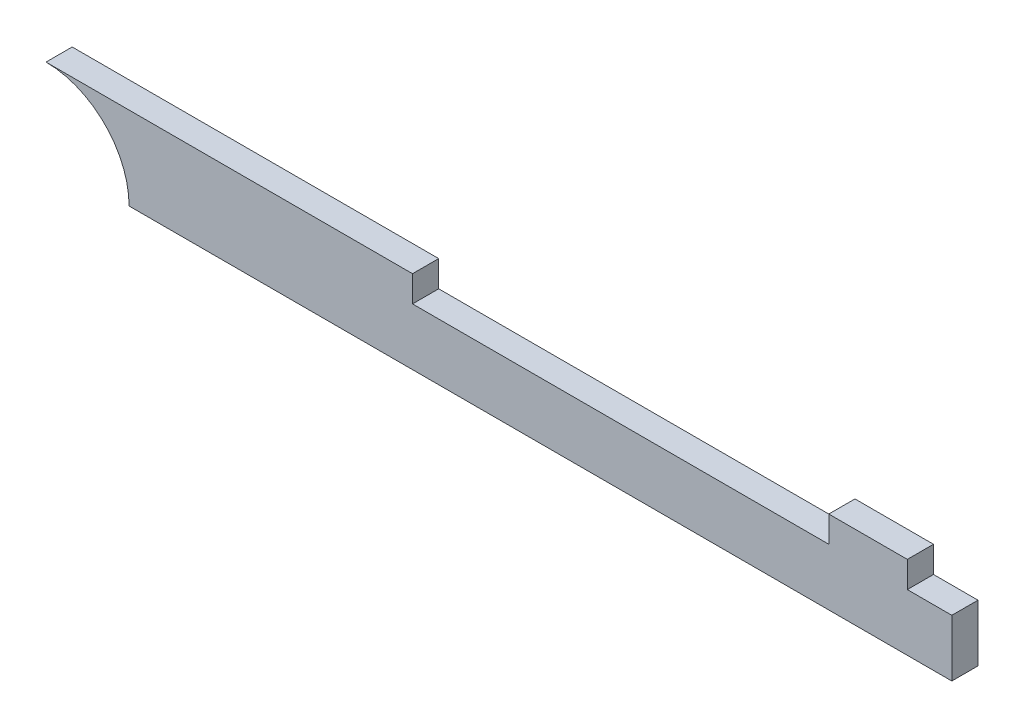
ISO-10303-21;
HEADER;
FILE_DESCRIPTION(('STEP AP214'),'2;1');
FILE_NAME('part.step','',(''),(''),'','','');
FILE_SCHEMA(('AUTOMOTIVE_DESIGN { 1 0 10303 214 1 1 1 1 }'));
ENDSEC;
DATA;
#1=APPLICATION_CONTEXT('core data for automotive mechanical design processes');
#2=APPLICATION_PROTOCOL_DEFINITION('international standard','automotive_design',2000,#1);
#3=PRODUCT_CONTEXT('',#1,'mechanical');
#4=PRODUCT('Part','Part','',(#3));
#5=PRODUCT_RELATED_PRODUCT_CATEGORY('part','',(#4));
#6=PRODUCT_DEFINITION_FORMATION('','',#4);
#7=PRODUCT_DEFINITION_CONTEXT('part definition',#1,'design');
#8=PRODUCT_DEFINITION('design','',#6,#7);
#9=PRODUCT_DEFINITION_SHAPE('','',#8);
#10=(LENGTH_UNIT() NAMED_UNIT(*) SI_UNIT(.MILLI.,.METRE.));
#11=(NAMED_UNIT(*) PLANE_ANGLE_UNIT() SI_UNIT($,.RADIAN.));
#12=(NAMED_UNIT(*) SI_UNIT($,.STERADIAN.) SOLID_ANGLE_UNIT());
#13=UNCERTAINTY_MEASURE_WITH_UNIT(LENGTH_MEASURE(1.E-05),#10,'distance_accuracy_value','');
#14=(GEOMETRIC_REPRESENTATION_CONTEXT(3) GLOBAL_UNCERTAINTY_ASSIGNED_CONTEXT((#13)) GLOBAL_UNIT_ASSIGNED_CONTEXT((#10,
#11,#12)) REPRESENTATION_CONTEXT('',''));
#15=CARTESIAN_POINT('',(0.,0.,0.));
#16=DIRECTION('',(0.,0.,1.));
#17=DIRECTION('',(1.,0.,0.));
#18=AXIS2_PLACEMENT_3D('',#15,#16,#17);
#19=CARTESIAN_POINT('',(0.,0.,2.5));
#20=DIRECTION('',(0.,0.,-1.));
#21=DIRECTION('',(-1.,0.,0.));
#22=AXIS2_PLACEMENT_3D('',#19,#20,#21);
#23=CYLINDRICAL_SURFACE('',#22,15.875);
#24=CARTESIAN_POINT('',(0.,0.,-2.5));
#25=DIRECTION('',(0.,0.,1.));
#26=DIRECTION('',(1.,0.,0.));
#27=AXIS2_PLACEMENT_3D('',#24,#25,#26);
#28=CIRCLE('',#27,15.875);
#29=CARTESIAN_POINT('',(15.875,0.,-2.5));
#30=VERTEX_POINT('',#29);
#31=CARTESIAN_POINT('',(0.,15.875,-2.5));
#32=VERTEX_POINT('',#31);
#33=EDGE_CURVE('E149',#30,#32,#28,.T.);
#34=ORIENTED_EDGE('',*,*,#33,.F.);
#35=DIRECTION('',(0.,0.,-1.));
#36=VECTOR('',#35,1.);
#37=CARTESIAN_POINT('',(15.875,0.,2.5));
#38=LINE('',#37,#36);
#39=CARTESIAN_POINT('',(15.875,0.,2.5));
#40=VERTEX_POINT('',#39);
#41=EDGE_CURVE('E11',#40,#30,#38,.T.);
#42=ORIENTED_EDGE('',*,*,#41,.F.);
#43=CARTESIAN_POINT('',(0.,0.,2.5));
#44=DIRECTION('',(0.,0.,1.));
#45=DIRECTION('',(1.,0.,0.));
#46=AXIS2_PLACEMENT_3D('',#43,#44,#45);
#47=CIRCLE('',#46,15.875);
#48=CARTESIAN_POINT('',(0.,15.875,2.5));
#49=VERTEX_POINT('',#48);
#50=EDGE_CURVE('E174',#40,#49,#47,.T.);
#51=ORIENTED_EDGE('',*,*,#50,.T.);
#52=DIRECTION('',(0.,0.,-1.));
#53=VECTOR('',#52,1.);
#54=CARTESIAN_POINT('',(0.,15.875,2.5));
#55=LINE('',#54,#53);
#56=EDGE_CURVE('E57',#49,#32,#55,.T.);
#57=ORIENTED_EDGE('',*,*,#56,.T.);
#58=EDGE_LOOP('',(#34,#42,#51,#57));
#59=FACE_BOUND('',#58,.T.);
#60=ADVANCED_FACE('F41',(#59),#23,.F.);
#61=CARTESIAN_POINT('',(0.,0.,2.5));
#62=DIRECTION('',(0.,1.,0.));
#63=DIRECTION('',(0.,0.,1.));
#64=AXIS2_PLACEMENT_3D('',#61,#62,#63);
#65=PLANE('',#64);
#66=DIRECTION('',(1.,0.,0.));
#67=VECTOR('',#66,1.);
#68=CARTESIAN_POINT('',(0.,0.,-2.5));
#69=LINE('',#68,#67);
#70=CARTESIAN_POINT('',(173.,0.,-2.5));
#71=VERTEX_POINT('',#70);
#72=EDGE_CURVE('E151',#30,#71,#69,.T.);
#73=ORIENTED_EDGE('',*,*,#72,.T.);
#74=DIRECTION('',(0.,0.,-1.));
#75=VECTOR('',#74,1.);
#76=CARTESIAN_POINT('',(173.,0.,2.5));
#77=LINE('',#76,#75);
#78=CARTESIAN_POINT('',(173.,0.,2.5));
#79=VERTEX_POINT('',#78);
#80=EDGE_CURVE('E49',#79,#71,#77,.T.);
#81=ORIENTED_EDGE('',*,*,#80,.F.);
#82=DIRECTION('',(1.,0.,0.));
#83=VECTOR('',#82,1.);
#84=CARTESIAN_POINT('',(0.,0.,2.5));
#85=LINE('',#84,#83);
#86=EDGE_CURVE('E205',#40,#79,#85,.T.);
#87=ORIENTED_EDGE('',*,*,#86,.F.);
#88=ORIENTED_EDGE('',*,*,#41,.T.);
#89=EDGE_LOOP('',(#73,#81,#87,#88));
#90=FACE_BOUND('',#89,.T.);
#91=ADVANCED_FACE('F194',(#90),#65,.F.);
#92=CARTESIAN_POINT('',(173.,0.,2.5));
#93=DIRECTION('',(1.,0.,0.));
#94=DIRECTION('',(0.,0.,-1.));
#95=AXIS2_PLACEMENT_3D('',#92,#93,#94);
#96=PLANE('',#95);
#97=DIRECTION('',(0.,-1.,0.));
#98=VECTOR('',#97,1.);
#99=CARTESIAN_POINT('',(173.,0.,-2.5));
#100=LINE('',#99,#98);
#101=CARTESIAN_POINT('',(173.,10.875,-2.5));
#102=VERTEX_POINT('',#101);
#103=EDGE_CURVE('E154',#102,#71,#100,.T.);
#104=ORIENTED_EDGE('',*,*,#103,.F.);
#105=DIRECTION('',(0.,0.,-1.));
#106=VECTOR('',#105,1.);
#107=CARTESIAN_POINT('',(173.,10.875,2.5));
#108=LINE('',#107,#106);
#109=CARTESIAN_POINT('',(173.,10.875,2.5));
#110=VERTEX_POINT('',#109);
#111=EDGE_CURVE('E184',#110,#102,#108,.T.);
#112=ORIENTED_EDGE('',*,*,#111,.F.);
#113=DIRECTION('',(0.,-1.,0.));
#114=VECTOR('',#113,1.);
#115=CARTESIAN_POINT('',(173.,0.,2.5));
#116=LINE('',#115,#114);
#117=EDGE_CURVE('E191',#110,#79,#116,.T.);
#118=ORIENTED_EDGE('',*,*,#117,.T.);
#119=ORIENTED_EDGE('',*,*,#80,.T.);
#120=EDGE_LOOP('',(#104,#112,#118,#119));
#121=FACE_BOUND('',#120,.T.);
#122=ADVANCED_FACE('F189',(#121),#96,.T.);
#123=CARTESIAN_POINT('',(0.,10.875,2.5));
#124=DIRECTION('',(0.,1.,0.));
#125=DIRECTION('',(0.,0.,1.));
#126=AXIS2_PLACEMENT_3D('',#123,#124,#125);
#127=PLANE('',#126);
#128=DIRECTION('',(1.,0.,0.));
#129=VECTOR('',#128,1.);
#130=CARTESIAN_POINT('',(0.,10.875,-2.5));
#131=LINE('',#130,#129);
#132=CARTESIAN_POINT('',(164.5,10.875,-2.5));
#133=VERTEX_POINT('',#132);
#134=EDGE_CURVE('E157',#133,#102,#131,.T.);
#135=ORIENTED_EDGE('',*,*,#134,.F.);
#136=DIRECTION('',(0.,0.,-1.));
#137=VECTOR('',#136,1.);
#138=CARTESIAN_POINT('',(164.5,10.875,2.5));
#139=LINE('',#138,#137);
#140=CARTESIAN_POINT('',(164.5,10.875,2.5));
#141=VERTEX_POINT('',#140);
#142=EDGE_CURVE('E182',#141,#133,#139,.T.);
#143=ORIENTED_EDGE('',*,*,#142,.F.);
#144=DIRECTION('',(1.,0.,0.));
#145=VECTOR('',#144,1.);
#146=CARTESIAN_POINT('',(0.,10.875,2.5));
#147=LINE('',#146,#145);
#148=EDGE_CURVE('E141',#141,#110,#147,.T.);
#149=ORIENTED_EDGE('',*,*,#148,.T.);
#150=ORIENTED_EDGE('',*,*,#111,.T.);
#151=EDGE_LOOP('',(#135,#143,#149,#150));
#152=FACE_BOUND('',#151,.T.);
#153=ADVANCED_FACE('F200',(#152),#127,.T.);
#154=CARTESIAN_POINT('',(164.5,0.,2.5));
#155=DIRECTION('',(1.,0.,0.));
#156=DIRECTION('',(0.,0.,-1.));
#157=AXIS2_PLACEMENT_3D('',#154,#155,#156);
#158=PLANE('',#157);
#159=DIRECTION('',(0.,-1.,0.));
#160=VECTOR('',#159,1.);
#161=CARTESIAN_POINT('',(164.5,0.,-2.5));
#162=LINE('',#161,#160);
#163=CARTESIAN_POINT('',(164.5,15.875,-2.5));
#164=VERTEX_POINT('',#163);
#165=EDGE_CURVE('E160',#164,#133,#162,.T.);
#166=ORIENTED_EDGE('',*,*,#165,.F.);
#167=DIRECTION('',(0.,0.,-1.));
#168=VECTOR('',#167,1.);
#169=CARTESIAN_POINT('',(164.5,15.875,2.5));
#170=LINE('',#169,#168);
#171=CARTESIAN_POINT('',(164.5,15.875,2.5));
#172=VERTEX_POINT('',#171);
#173=EDGE_CURVE('E180',#172,#164,#170,.T.);
#174=ORIENTED_EDGE('',*,*,#173,.F.);
#175=DIRECTION('',(0.,-1.,0.));
#176=VECTOR('',#175,1.);
#177=CARTESIAN_POINT('',(164.5,0.,2.5));
#178=LINE('',#177,#176);
#179=EDGE_CURVE('E207',#172,#141,#178,.T.);
#180=ORIENTED_EDGE('',*,*,#179,.T.);
#181=ORIENTED_EDGE('',*,*,#142,.T.);
#182=EDGE_LOOP('',(#166,#174,#180,#181));
#183=FACE_BOUND('',#182,.T.);
#184=ADVANCED_FACE('F217',(#183),#158,.T.);
#185=CARTESIAN_POINT('',(0.,15.875,2.5));
#186=DIRECTION('',(0.,1.,0.));
#187=DIRECTION('',(0.,0.,1.));
#188=AXIS2_PLACEMENT_3D('',#185,#186,#187);
#189=PLANE('',#188);
#190=DIRECTION('',(1.,0.,0.));
#191=VECTOR('',#190,1.);
#192=CARTESIAN_POINT('',(0.,15.875,-2.5));
#193=LINE('',#192,#191);
#194=CARTESIAN_POINT('',(149.5,15.875,-2.5));
#195=VERTEX_POINT('',#194);
#196=EDGE_CURVE('E163',#195,#164,#193,.T.);
#197=ORIENTED_EDGE('',*,*,#196,.F.);
#198=DIRECTION('',(0.,0.,-1.));
#199=VECTOR('',#198,1.);
#200=CARTESIAN_POINT('',(149.5,15.875,2.5));
#201=LINE('',#200,#199);
#202=CARTESIAN_POINT('',(149.5,15.875,2.5));
#203=VERTEX_POINT('',#202);
#204=EDGE_CURVE('E178',#203,#195,#201,.T.);
#205=ORIENTED_EDGE('',*,*,#204,.F.);
#206=DIRECTION('',(1.,0.,0.));
#207=VECTOR('',#206,1.);
#208=CARTESIAN_POINT('',(0.,15.875,2.5));
#209=LINE('',#208,#207);
#210=EDGE_CURVE('E211',#203,#172,#209,.T.);
#211=ORIENTED_EDGE('',*,*,#210,.T.);
#212=ORIENTED_EDGE('',*,*,#173,.T.);
#213=EDGE_LOOP('',(#197,#205,#211,#212));
#214=FACE_BOUND('',#213,.T.);
#215=ADVANCED_FACE('F215',(#214),#189,.T.);
#216=CARTESIAN_POINT('',(149.5,0.,2.5));
#217=DIRECTION('',(1.,0.,0.));
#218=DIRECTION('',(0.,0.,-1.));
#219=AXIS2_PLACEMENT_3D('',#216,#217,#218);
#220=PLANE('',#219);
#221=DIRECTION('',(0.,-1.,0.));
#222=VECTOR('',#221,1.);
#223=CARTESIAN_POINT('',(149.5,0.,-2.5));
#224=LINE('',#223,#222);
#225=CARTESIAN_POINT('',(149.5,10.875,-2.5));
#226=VERTEX_POINT('',#225);
#227=EDGE_CURVE('E166',#195,#226,#224,.T.);
#228=ORIENTED_EDGE('',*,*,#227,.T.);
#229=DIRECTION('',(0.,0.,-1.));
#230=VECTOR('',#229,1.);
#231=CARTESIAN_POINT('',(149.5,10.875,2.5));
#232=LINE('',#231,#230);
#233=CARTESIAN_POINT('',(149.5,10.875,2.5));
#234=VERTEX_POINT('',#233);
#235=EDGE_CURVE('E128',#234,#226,#232,.T.);
#236=ORIENTED_EDGE('',*,*,#235,.F.);
#237=DIRECTION('',(0.,-1.,0.));
#238=VECTOR('',#237,1.);
#239=CARTESIAN_POINT('',(149.5,0.,2.5));
#240=LINE('',#239,#238);
#241=EDGE_CURVE('E138',#203,#234,#240,.T.);
#242=ORIENTED_EDGE('',*,*,#241,.F.);
#243=ORIENTED_EDGE('',*,*,#204,.T.);
#244=EDGE_LOOP('',(#228,#236,#242,#243));
#245=FACE_BOUND('',#244,.T.);
#246=ADVANCED_FACE('F220',(#245),#220,.F.);
#247=CARTESIAN_POINT('',(70.,10.875,-2.5));
#248=VERTEX_POINT('',#247);
#249=EDGE_CURVE('E124',#248,#226,#131,.T.);
#250=ORIENTED_EDGE('',*,*,#249,.F.);
#251=DIRECTION('',(0.,0.,-1.));
#252=VECTOR('',#251,1.);
#253=CARTESIAN_POINT('',(70.,10.875,2.5));
#254=LINE('',#253,#252);
#255=CARTESIAN_POINT('',(70.,10.875,2.5));
#256=VERTEX_POINT('',#255);
#257=EDGE_CURVE('E119',#256,#248,#254,.T.);
#258=ORIENTED_EDGE('',*,*,#257,.F.);
#259=EDGE_CURVE('E122',#256,#234,#147,.T.);
#260=ORIENTED_EDGE('',*,*,#259,.T.);
#261=ORIENTED_EDGE('',*,*,#235,.T.);
#262=EDGE_LOOP('',(#250,#258,#260,#261));
#263=FACE_BOUND('',#262,.T.);
#264=ADVANCED_FACE('F121',(#263),#127,.T.);
#265=CARTESIAN_POINT('',(70.,0.,2.5));
#266=DIRECTION('',(1.,0.,0.));
#267=DIRECTION('',(0.,0.,-1.));
#268=AXIS2_PLACEMENT_3D('',#265,#266,#267);
#269=PLANE('',#268);
#270=DIRECTION('',(0.,-1.,0.));
#271=VECTOR('',#270,1.);
#272=CARTESIAN_POINT('',(70.,0.,-2.5));
#273=LINE('',#272,#271);
#274=CARTESIAN_POINT('',(70.,15.875,-2.5));
#275=VERTEX_POINT('',#274);
#276=EDGE_CURVE('E169',#275,#248,#273,.T.);
#277=ORIENTED_EDGE('',*,*,#276,.F.);
#278=DIRECTION('',(0.,0.,-1.));
#279=VECTOR('',#278,1.);
#280=CARTESIAN_POINT('',(70.,15.875,2.5));
#281=LINE('',#280,#279);
#282=CARTESIAN_POINT('',(70.,15.875,2.5));
#283=VERTEX_POINT('',#282);
#284=EDGE_CURVE('E88',#283,#275,#281,.T.);
#285=ORIENTED_EDGE('',*,*,#284,.F.);
#286=DIRECTION('',(0.,-1.,0.));
#287=VECTOR('',#286,1.);
#288=CARTESIAN_POINT('',(70.,0.,2.5));
#289=LINE('',#288,#287);
#290=EDGE_CURVE('E135',#283,#256,#289,.T.);
#291=ORIENTED_EDGE('',*,*,#290,.T.);
#292=ORIENTED_EDGE('',*,*,#257,.T.);
#293=EDGE_LOOP('',(#277,#285,#291,#292));
#294=FACE_BOUND('',#293,.T.);
#295=ADVANCED_FACE('F142',(#294),#269,.T.);
#296=CARTESIAN_POINT('',(0.,15.875,2.5));
#297=DIRECTION('',(0.,1.,0.));
#298=DIRECTION('',(0.,0.,1.));
#299=AXIS2_PLACEMENT_3D('',#296,#297,#298);
#300=PLANE('',#299);
#301=DIRECTION('',(1.,0.,0.));
#302=VECTOR('',#301,1.);
#303=CARTESIAN_POINT('',(0.,15.875,-2.5));
#304=LINE('',#303,#302);
#305=EDGE_CURVE('E171',#32,#275,#304,.T.);
#306=ORIENTED_EDGE('',*,*,#305,.F.);
#307=ORIENTED_EDGE('',*,*,#56,.F.);
#308=DIRECTION('',(1.,0.,0.));
#309=VECTOR('',#308,1.);
#310=CARTESIAN_POINT('',(0.,15.875,2.5));
#311=LINE('',#310,#309);
#312=EDGE_CURVE('E143',#49,#283,#311,.T.);
#313=ORIENTED_EDGE('',*,*,#312,.T.);
#314=ORIENTED_EDGE('',*,*,#284,.T.);
#315=EDGE_LOOP('',(#306,#307,#313,#314));
#316=FACE_BOUND('',#315,.T.);
#317=ADVANCED_FACE('F233',(#316),#300,.T.);
#318=CARTESIAN_POINT('',(0.,0.,2.5));
#319=DIRECTION('',(0.,0.,1.));
#320=DIRECTION('',(1.,0.,0.));
#321=AXIS2_PLACEMENT_3D('',#318,#319,#320);
#322=PLANE('',#321);
#323=ORIENTED_EDGE('',*,*,#50,.F.);
#324=ORIENTED_EDGE('',*,*,#86,.T.);
#325=ORIENTED_EDGE('',*,*,#117,.F.);
#326=ORIENTED_EDGE('',*,*,#148,.F.);
#327=ORIENTED_EDGE('',*,*,#179,.F.);
#328=ORIENTED_EDGE('',*,*,#210,.F.);
#329=ORIENTED_EDGE('',*,*,#241,.T.);
#330=ORIENTED_EDGE('',*,*,#259,.F.);
#331=ORIENTED_EDGE('',*,*,#290,.F.);
#332=ORIENTED_EDGE('',*,*,#312,.F.);
#333=EDGE_LOOP('',(#323,#324,#325,#326,#327,#328,#329,#330,#331,#332));
#334=FACE_BOUND('',#333,.T.);
#335=ADVANCED_FACE('F133',(#334),#322,.T.);
#336=CARTESIAN_POINT('',(0.,0.,-2.5));
#337=DIRECTION('',(0.,0.,1.));
#338=DIRECTION('',(1.,0.,0.));
#339=AXIS2_PLACEMENT_3D('',#336,#337,#338);
#340=PLANE('',#339);
#341=ORIENTED_EDGE('',*,*,#33,.T.);
#342=ORIENTED_EDGE('',*,*,#305,.T.);
#343=ORIENTED_EDGE('',*,*,#276,.T.);
#344=ORIENTED_EDGE('',*,*,#249,.T.);
#345=ORIENTED_EDGE('',*,*,#227,.F.);
#346=ORIENTED_EDGE('',*,*,#196,.T.);
#347=ORIENTED_EDGE('',*,*,#165,.T.);
#348=ORIENTED_EDGE('',*,*,#134,.T.);
#349=ORIENTED_EDGE('',*,*,#103,.T.);
#350=ORIENTED_EDGE('',*,*,#72,.F.);
#351=EDGE_LOOP('',(#341,#342,#343,#344,#345,#346,#347,#348,#349,#350));
#352=FACE_BOUND('',#351,.T.);
#353=ADVANCED_FACE('F196',(#352),#340,.F.);
#354=CLOSED_SHELL('',(#60,#91,#122,#153,#184,#215,#246,#264,#295,#317,#335,#353));
#355=MANIFOLD_SOLID_BREP('B2',#354);
#356=ADVANCED_BREP_SHAPE_REPRESENTATION('',(#18,#355),#14);
#357=SHAPE_DEFINITION_REPRESENTATION(#9,#356);
ENDSEC;
END-ISO-10303-21;
